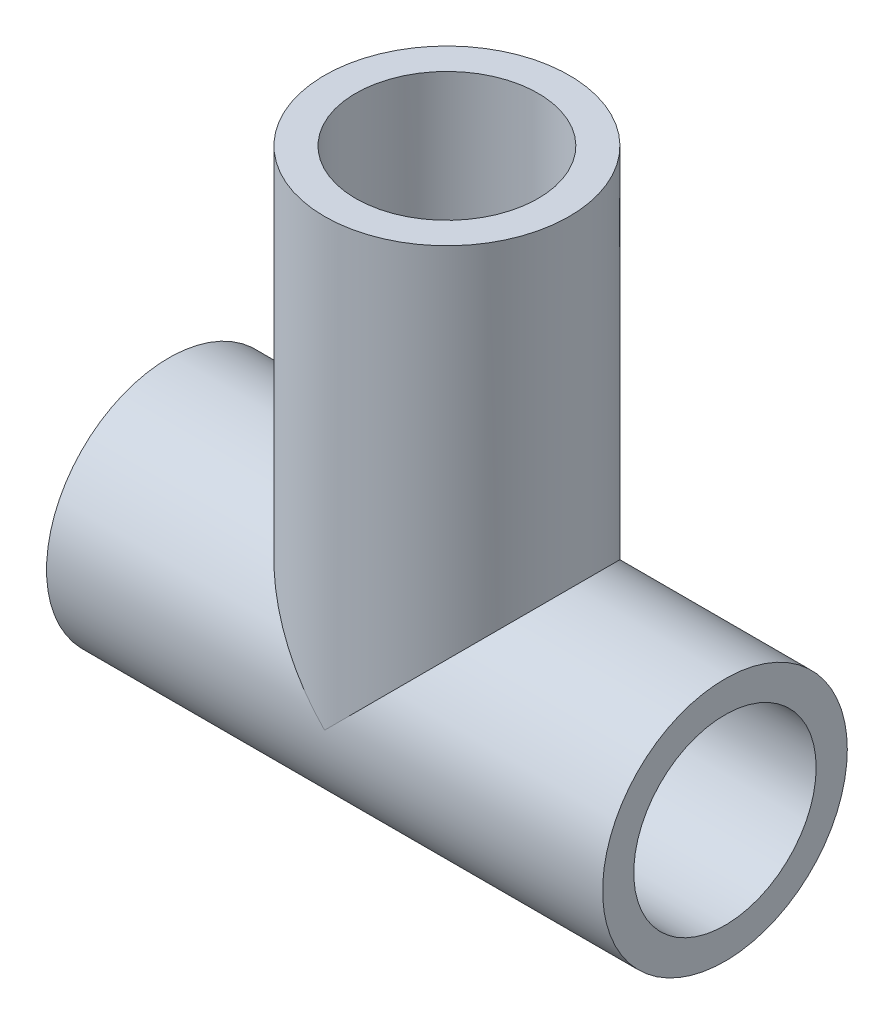
ISO-10303-21;
HEADER;
FILE_DESCRIPTION(('STEP AP214'),'2;1');
FILE_NAME('part.step','',(''),(''),'','','');
FILE_SCHEMA(('AUTOMOTIVE_DESIGN { 1 0 10303 214 1 1 1 1 }'));
ENDSEC;
DATA;
#1=APPLICATION_CONTEXT('core data for automotive mechanical design processes');
#2=APPLICATION_PROTOCOL_DEFINITION('international standard','automotive_design',2000,#1);
#3=PRODUCT_CONTEXT('',#1,'mechanical');
#4=PRODUCT('Part','Part','',(#3));
#5=PRODUCT_RELATED_PRODUCT_CATEGORY('part','',(#4));
#6=PRODUCT_DEFINITION_FORMATION('','',#4);
#7=PRODUCT_DEFINITION_CONTEXT('part definition',#1,'design');
#8=PRODUCT_DEFINITION('design','',#6,#7);
#9=PRODUCT_DEFINITION_SHAPE('','',#8);
#10=(LENGTH_UNIT() NAMED_UNIT(*) SI_UNIT(.MILLI.,.METRE.));
#11=(NAMED_UNIT(*) PLANE_ANGLE_UNIT() SI_UNIT($,.RADIAN.));
#12=(NAMED_UNIT(*) SI_UNIT($,.STERADIAN.) SOLID_ANGLE_UNIT());
#13=UNCERTAINTY_MEASURE_WITH_UNIT(LENGTH_MEASURE(1.E-05),#10,'distance_accuracy_value','');
#14=(GEOMETRIC_REPRESENTATION_CONTEXT(3) GLOBAL_UNCERTAINTY_ASSIGNED_CONTEXT((#13)) GLOBAL_UNIT_ASSIGNED_CONTEXT((#10,
#11,#12)) REPRESENTATION_CONTEXT('',''));
#15=CARTESIAN_POINT('',(0.,0.,0.));
#16=DIRECTION('',(0.,0.,1.));
#17=DIRECTION('',(1.,0.,0.));
#18=AXIS2_PLACEMENT_3D('',#15,#16,#17);
#19=CARTESIAN_POINT('',(12.5,0.,0.));
#20=DIRECTION('',(-1.,0.,0.));
#21=DIRECTION('',(0.,0.,1.));
#22=AXIS2_PLACEMENT_3D('',#19,#20,#21);
#23=CYLINDRICAL_SURFACE('',#22,4.1);
#24=CARTESIAN_POINT('',(12.5,0.,0.));
#25=DIRECTION('',(1.,0.,0.));
#26=DIRECTION('',(0.,0.,-1.));
#27=AXIS2_PLACEMENT_3D('',#24,#25,#26);
#28=CIRCLE('',#27,4.1);
#29=CARTESIAN_POINT('',(12.5,0.,-4.1));
#30=VERTEX_POINT('',#29);
#31=EDGE_CURVE('E78',#30,#30,#28,.T.);
#32=ORIENTED_EDGE('',*,*,#31,.T.);
#33=EDGE_LOOP('',(#32));
#34=FACE_BOUND('',#33,.T.);
#35=CARTESIAN_POINT('',(-12.5,0.,0.));
#36=DIRECTION('',(1.,0.,0.));
#37=DIRECTION('',(0.,0.,-1.));
#38=AXIS2_PLACEMENT_3D('',#35,#36,#37);
#39=CIRCLE('',#38,4.1);
#40=CARTESIAN_POINT('',(-12.5,0.,-4.1));
#41=VERTEX_POINT('',#40);
#42=EDGE_CURVE('E77',#41,#41,#39,.T.);
#43=ORIENTED_EDGE('',*,*,#42,.F.);
#44=EDGE_LOOP('',(#43));
#45=FACE_BOUND('',#44,.T.);
#46=CARTESIAN_POINT('',(0.,0.,0.));
#47=DIRECTION('',(-0.707106781186547,0.707106781186547,0.));
#48=DIRECTION('',(-0.707106781186547,-0.707106781186547,0.));
#49=AXIS2_PLACEMENT_3D('',#46,#47,#48);
#50=ELLIPSE('',#49,5.79827560572969,4.1);
#51=CARTESIAN_POINT('',(0.,0.,4.1));
#52=VERTEX_POINT('',#51);
#53=CARTESIAN_POINT('',(0.,0.,-4.1));
#54=VERTEX_POINT('',#53);
#55=EDGE_CURVE('E65',#52,#54,#50,.T.);
#56=ORIENTED_EDGE('',*,*,#55,.T.);
#57=CARTESIAN_POINT('',(0.,0.,0.));
#58=DIRECTION('',(-0.707106781186547,-0.707106781186547,0.));
#59=DIRECTION('',(-0.707106781186547,0.707106781186547,0.));
#60=AXIS2_PLACEMENT_3D('',#57,#58,#59);
#61=ELLIPSE('',#60,5.79827560572969,4.1);
#62=EDGE_CURVE('E53',#54,#52,#61,.F.);
#63=ORIENTED_EDGE('',*,*,#62,.T.);
#64=EDGE_LOOP('',(#56,#63));
#65=FACE_BOUND('',#64,.T.);
#66=ADVANCED_FACE('F37',(#34,#45,#65),#23,.F.);
#67=CARTESIAN_POINT('',(12.5,0.,0.));
#68=DIRECTION('',(-1.,0.,0.));
#69=DIRECTION('',(0.,0.,1.));
#70=AXIS2_PLACEMENT_3D('',#67,#68,#69);
#71=CYLINDRICAL_SURFACE('',#70,5.5);
#72=CARTESIAN_POINT('',(-12.5,0.,0.));
#73=DIRECTION('',(1.,0.,0.));
#74=DIRECTION('',(0.,0.,-1.));
#75=AXIS2_PLACEMENT_3D('',#72,#73,#74);
#76=CIRCLE('',#75,5.5);
#77=CARTESIAN_POINT('',(-12.5,0.,-5.5));
#78=VERTEX_POINT('',#77);
#79=EDGE_CURVE('E46',#78,#78,#76,.T.);
#80=ORIENTED_EDGE('',*,*,#79,.T.);
#81=EDGE_LOOP('',(#80));
#82=FACE_BOUND('',#81,.T.);
#83=CARTESIAN_POINT('',(12.5,0.,0.));
#84=DIRECTION('',(1.,0.,0.));
#85=DIRECTION('',(0.,0.,-1.));
#86=AXIS2_PLACEMENT_3D('',#83,#84,#85);
#87=CIRCLE('',#86,5.5);
#88=CARTESIAN_POINT('',(12.5,0.,-5.5));
#89=VERTEX_POINT('',#88);
#90=EDGE_CURVE('E11',#89,#89,#87,.T.);
#91=ORIENTED_EDGE('',*,*,#90,.F.);
#92=EDGE_LOOP('',(#91));
#93=FACE_BOUND('',#92,.T.);
#94=CARTESIAN_POINT('',(0.,0.,0.));
#95=DIRECTION('',(-0.707106781186547,-0.707106781186547,0.));
#96=DIRECTION('',(-0.707106781186547,0.707106781186547,0.));
#97=AXIS2_PLACEMENT_3D('',#94,#95,#96);
#98=ELLIPSE('',#97,7.77817459305202,5.5);
#99=CARTESIAN_POINT('',(0.,0.,-5.5));
#100=VERTEX_POINT('',#99);
#101=CARTESIAN_POINT('',(0.,0.,5.5));
#102=VERTEX_POINT('',#101);
#103=EDGE_CURVE('E75',#100,#102,#98,.F.);
#104=ORIENTED_EDGE('',*,*,#103,.F.);
#105=CARTESIAN_POINT('',(0.,0.,0.));
#106=DIRECTION('',(-0.707106781186547,0.707106781186547,0.));
#107=DIRECTION('',(-0.707106781186547,-0.707106781186547,0.));
#108=AXIS2_PLACEMENT_3D('',#105,#106,#107);
#109=ELLIPSE('',#108,7.77817459305202,5.5);
#110=EDGE_CURVE('E60',#102,#100,#109,.T.);
#111=ORIENTED_EDGE('',*,*,#110,.F.);
#112=EDGE_LOOP('',(#104,#111));
#113=FACE_BOUND('',#112,.T.);
#114=ADVANCED_FACE('F39',(#82,#93,#113),#71,.T.);
#115=CARTESIAN_POINT('',(12.5,0.,0.));
#116=DIRECTION('',(1.,0.,0.));
#117=DIRECTION('',(0.,0.,-1.));
#118=AXIS2_PLACEMENT_3D('',#115,#116,#117);
#119=PLANE('',#118);
#120=ORIENTED_EDGE('',*,*,#90,.T.);
#121=EDGE_LOOP('',(#120));
#122=FACE_BOUND('',#121,.T.);
#123=ORIENTED_EDGE('',*,*,#31,.F.);
#124=EDGE_LOOP('',(#123));
#125=FACE_BOUND('',#124,.T.);
#126=ADVANCED_FACE('F91',(#122,#125),#119,.T.);
#127=CARTESIAN_POINT('',(-12.5,0.,0.));
#128=DIRECTION('',(1.,0.,0.));
#129=DIRECTION('',(0.,0.,-1.));
#130=AXIS2_PLACEMENT_3D('',#127,#128,#129);
#131=PLANE('',#130);
#132=ORIENTED_EDGE('',*,*,#79,.F.);
#133=EDGE_LOOP('',(#132));
#134=FACE_BOUND('',#133,.T.);
#135=ORIENTED_EDGE('',*,*,#42,.T.);
#136=EDGE_LOOP('',(#135));
#137=FACE_BOUND('',#136,.T.);
#138=ADVANCED_FACE('F87',(#134,#137),#131,.F.);
#139=CARTESIAN_POINT('',(0.,20.,0.));
#140=DIRECTION('',(0.,-1.,0.));
#141=DIRECTION('',(0.,0.,-1.));
#142=AXIS2_PLACEMENT_3D('',#139,#140,#141);
#143=CYLINDRICAL_SURFACE('',#142,5.5);
#144=CARTESIAN_POINT('',(0.,20.,0.));
#145=DIRECTION('',(0.,1.,0.));
#146=DIRECTION('',(0.,0.,1.));
#147=AXIS2_PLACEMENT_3D('',#144,#145,#146);
#148=CIRCLE('',#147,5.5);
#149=CARTESIAN_POINT('',(0.,20.,5.5));
#150=VERTEX_POINT('',#149);
#151=EDGE_CURVE('E69',#150,#150,#148,.T.);
#152=ORIENTED_EDGE('',*,*,#151,.F.);
#153=EDGE_LOOP('',(#152));
#154=FACE_BOUND('',#153,.T.);
#155=ORIENTED_EDGE('',*,*,#110,.T.);
#156=ORIENTED_EDGE('',*,*,#103,.T.);
#157=EDGE_LOOP('',(#155,#156));
#158=FACE_BOUND('',#157,.T.);
#159=ADVANCED_FACE('F90',(#154,#158),#143,.T.);
#160=CARTESIAN_POINT('',(0.,20.,0.));
#161=DIRECTION('',(0.,1.,0.));
#162=DIRECTION('',(0.,0.,1.));
#163=AXIS2_PLACEMENT_3D('',#160,#161,#162);
#164=PLANE('',#163);
#165=CARTESIAN_POINT('',(0.,20.,0.));
#166=DIRECTION('',(0.,1.,0.));
#167=DIRECTION('',(0.,0.,1.));
#168=AXIS2_PLACEMENT_3D('',#165,#166,#167);
#169=CIRCLE('',#168,4.1);
#170=CARTESIAN_POINT('',(0.,20.,4.1));
#171=VERTEX_POINT('',#170);
#172=EDGE_CURVE('E41',#171,#171,#169,.F.);
#173=ORIENTED_EDGE('',*,*,#172,.T.);
#174=EDGE_LOOP('',(#173));
#175=FACE_BOUND('',#174,.T.);
#176=ORIENTED_EDGE('',*,*,#151,.T.);
#177=EDGE_LOOP('',(#176));
#178=FACE_BOUND('',#177,.T.);
#179=ADVANCED_FACE('F112',(#175,#178),#164,.T.);
#180=CARTESIAN_POINT('',(0.,45.,0.));
#181=DIRECTION('',(0.,-1.,0.));
#182=DIRECTION('',(0.,0.,-1.));
#183=AXIS2_PLACEMENT_3D('',#180,#181,#182);
#184=CYLINDRICAL_SURFACE('',#183,4.1);
#185=ORIENTED_EDGE('',*,*,#172,.F.);
#186=EDGE_LOOP('',(#185));
#187=FACE_BOUND('',#186,.T.);
#188=ORIENTED_EDGE('',*,*,#55,.F.);
#189=ORIENTED_EDGE('',*,*,#62,.F.);
#190=EDGE_LOOP('',(#188,#189));
#191=FACE_BOUND('',#190,.T.);
#192=ADVANCED_FACE('F66',(#187,#191),#184,.F.);
#193=CLOSED_SHELL('',(#66,#114,#126,#138,#159,#179,#192));
#194=MANIFOLD_SOLID_BREP('B2',#193);
#195=ADVANCED_BREP_SHAPE_REPRESENTATION('',(#18,#194),#14);
#196=SHAPE_DEFINITION_REPRESENTATION(#9,#195);
ENDSEC;
END-ISO-10303-21;
